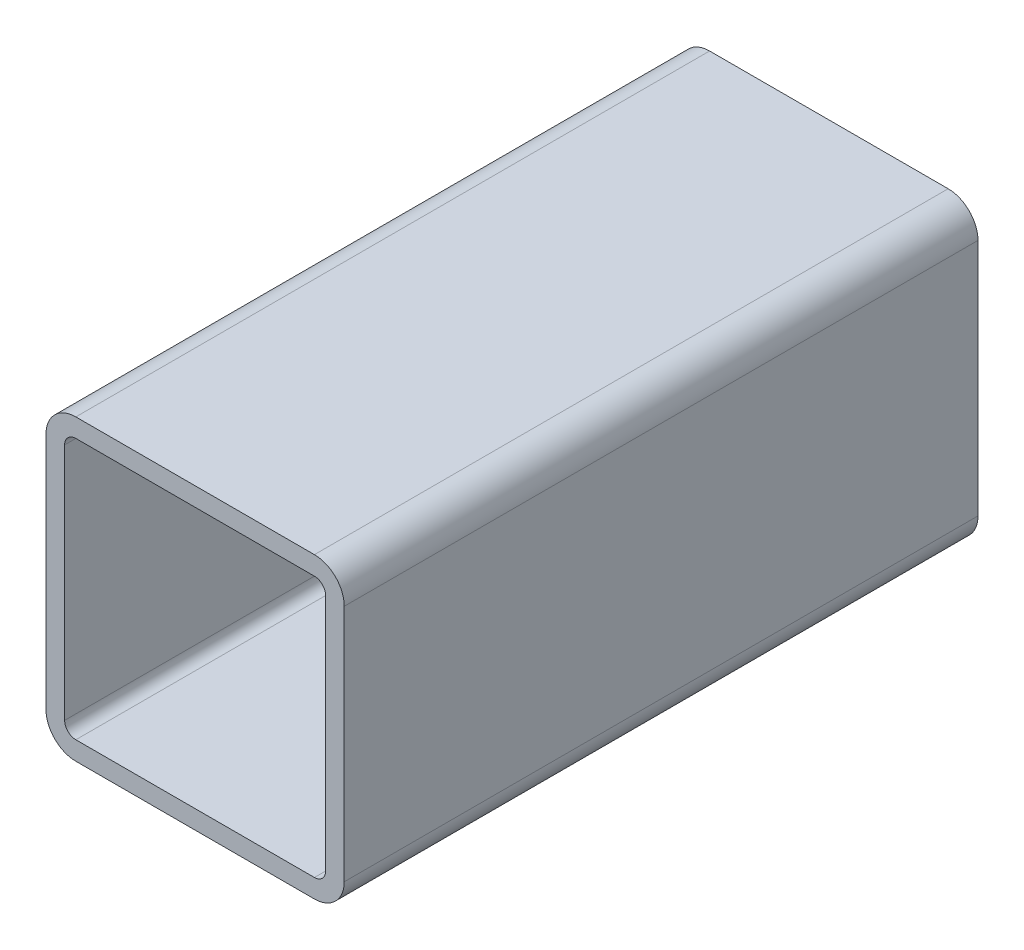
ISO-10303-21;
HEADER;
FILE_DESCRIPTION(('STEP AP214'),'2;1');
FILE_NAME('part.step','',(''),(''),'','','');
FILE_SCHEMA(('AUTOMOTIVE_DESIGN { 1 0 10303 214 1 1 1 1 }'));
ENDSEC;
DATA;
#1=APPLICATION_CONTEXT('core data for automotive mechanical design processes');
#2=APPLICATION_PROTOCOL_DEFINITION('international standard','automotive_design',2000,#1);
#3=PRODUCT_CONTEXT('',#1,'mechanical');
#4=PRODUCT('Part','Part','',(#3));
#5=PRODUCT_RELATED_PRODUCT_CATEGORY('part','',(#4));
#6=PRODUCT_DEFINITION_FORMATION('','',#4);
#7=PRODUCT_DEFINITION_CONTEXT('part definition',#1,'design');
#8=PRODUCT_DEFINITION('design','',#6,#7);
#9=PRODUCT_DEFINITION_SHAPE('','',#8);
#10=(LENGTH_UNIT() NAMED_UNIT(*) SI_UNIT(.MILLI.,.METRE.));
#11=(NAMED_UNIT(*) PLANE_ANGLE_UNIT() SI_UNIT($,.RADIAN.));
#12=(NAMED_UNIT(*) SI_UNIT($,.STERADIAN.) SOLID_ANGLE_UNIT());
#13=UNCERTAINTY_MEASURE_WITH_UNIT(LENGTH_MEASURE(1.E-05),#10,'distance_accuracy_value','');
#14=(GEOMETRIC_REPRESENTATION_CONTEXT(3) GLOBAL_UNCERTAINTY_ASSIGNED_CONTEXT((#13)) GLOBAL_UNIT_ASSIGNED_CONTEXT((#10,
#11,#12)) REPRESENTATION_CONTEXT('',''));
#15=CARTESIAN_POINT('',(0.,0.,0.));
#16=DIRECTION('',(0.,0.,1.));
#17=DIRECTION('',(1.,0.,0.));
#18=AXIS2_PLACEMENT_3D('',#15,#16,#17);
#19=CARTESIAN_POINT('',(-8.00000000000001,-5.62050406216485E-13,283.137084989848));
#20=DIRECTION('',(0.,1.,0.));
#21=DIRECTION('',(-1.,0.,0.));
#22=AXIS2_PLACEMENT_3D('',#19,#20,#21);
#23=PLANE('',#22);
#24=DIRECTION('',(1.,0.,0.));
#25=VECTOR('',#24,1.);
#26=CARTESIAN_POINT('',(-8.00000000000004,-5.62050406216485E-13,170.));
#27=LINE('',#26,#25);
#28=CARTESIAN_POINT('',(-72.,-5.72458747072346E-13,170.));
#29=VERTEX_POINT('',#28);
#30=CARTESIAN_POINT('',(-8.00000000000001,-5.62050406216485E-13,170.));
#31=VERTEX_POINT('',#30);
#32=EDGE_CURVE('E304',#29,#31,#27,.T.);
#33=ORIENTED_EDGE('',*,*,#32,.F.);
#34=DIRECTION('',(0.,0.,-1.));
#35=VECTOR('',#34,1.);
#36=CARTESIAN_POINT('',(-72.,-5.72458747072346E-13,283.137084989848));
#37=LINE('',#36,#35);
#38=CARTESIAN_POINT('',(-72.,-5.72458747072346E-13,0.));
#39=VERTEX_POINT('',#38);
#40=EDGE_CURVE('E48',#29,#39,#37,.T.);
#41=ORIENTED_EDGE('',*,*,#40,.T.);
#42=DIRECTION('',(1.,0.,0.));
#43=VECTOR('',#42,1.);
#44=CARTESIAN_POINT('',(-8.00000000000001,-5.62050406216485E-13,0.));
#45=LINE('',#44,#43);
#46=CARTESIAN_POINT('',(-8.00000000000001,-5.62050406216485E-13,0.));
#47=VERTEX_POINT('',#46);
#48=EDGE_CURVE('E199',#39,#47,#45,.T.);
#49=ORIENTED_EDGE('',*,*,#48,.T.);
#50=DIRECTION('',(0.,0.,-1.));
#51=VECTOR('',#50,1.);
#52=CARTESIAN_POINT('',(-8.00000000000001,-5.62050406216485E-13,283.137084989848));
#53=LINE('',#52,#51);
#54=EDGE_CURVE('E202',#31,#47,#53,.T.);
#55=ORIENTED_EDGE('',*,*,#54,.F.);
#56=EDGE_LOOP('',(#33,#41,#49,#55));
#57=FACE_BOUND('',#56,.T.);
#58=ADVANCED_FACE('F33',(#57),#23,.F.);
#59=CARTESIAN_POINT('',(-72.,7.99999999999943,283.137084989848));
#60=DIRECTION('',(0.,0.,-1.));
#61=DIRECTION('',(-1.,0.,0.));
#62=AXIS2_PLACEMENT_3D('',#59,#60,#61);
#63=CYLINDRICAL_SURFACE('',#62,8.00000000000001);
#64=CARTESIAN_POINT('',(-72.,7.99999999999943,170.));
#65=DIRECTION('',(0.,0.,1.));
#66=DIRECTION('',(0.,-1.,0.));
#67=AXIS2_PLACEMENT_3D('',#64,#65,#66);
#68=CIRCLE('',#67,8.00000000000001);
#69=CARTESIAN_POINT('',(-80.,7.99999999999943,170.));
#70=VERTEX_POINT('',#69);
#71=EDGE_CURVE('E240',#70,#29,#68,.T.);
#72=ORIENTED_EDGE('',*,*,#71,.F.);
#73=DIRECTION('',(0.,0.,-1.));
#74=VECTOR('',#73,1.);
#75=CARTESIAN_POINT('',(-80.,7.99999999999943,283.137084989848));
#76=LINE('',#75,#74);
#77=CARTESIAN_POINT('',(-80.,7.99999999999943,0.));
#78=VERTEX_POINT('',#77);
#79=EDGE_CURVE('E205',#70,#78,#76,.T.);
#80=ORIENTED_EDGE('',*,*,#79,.T.);
#81=CARTESIAN_POINT('',(-72.,7.99999999999943,0.));
#82=DIRECTION('',(0.,0.,1.));
#83=DIRECTION('',(1.,0.,0.));
#84=AXIS2_PLACEMENT_3D('',#81,#82,#83);
#85=CIRCLE('',#84,8.00000000000001);
#86=EDGE_CURVE('E197',#78,#39,#85,.T.);
#87=ORIENTED_EDGE('',*,*,#86,.T.);
#88=ORIENTED_EDGE('',*,*,#40,.F.);
#89=EDGE_LOOP('',(#72,#80,#87,#88));
#90=FACE_BOUND('',#89,.T.);
#91=ADVANCED_FACE('F237',(#90),#63,.T.);
#92=CARTESIAN_POINT('',(-80.,7.99999999999943,283.137084989848));
#93=DIRECTION('',(1.,0.,0.));
#94=DIRECTION('',(0.,1.,0.));
#95=AXIS2_PLACEMENT_3D('',#92,#93,#94);
#96=PLANE('',#95);
#97=DIRECTION('',(0.,-1.,0.));
#98=VECTOR('',#97,1.);
#99=CARTESIAN_POINT('',(-80.,7.99999999999946,170.));
#100=LINE('',#99,#98);
#101=CARTESIAN_POINT('',(-80.,71.9999999999994,170.));
#102=VERTEX_POINT('',#101);
#103=EDGE_CURVE('E245',#102,#70,#100,.T.);
#104=ORIENTED_EDGE('',*,*,#103,.F.);
#105=DIRECTION('',(0.,0.,-1.));
#106=VECTOR('',#105,1.);
#107=CARTESIAN_POINT('',(-80.,71.9999999999994,283.137084989848));
#108=LINE('',#107,#106);
#109=CARTESIAN_POINT('',(-80.,71.9999999999994,0.));
#110=VERTEX_POINT('',#109);
#111=EDGE_CURVE('E207',#102,#110,#108,.T.);
#112=ORIENTED_EDGE('',*,*,#111,.T.);
#113=DIRECTION('',(0.,-1.,0.));
#114=VECTOR('',#113,1.);
#115=CARTESIAN_POINT('',(-80.,7.99999999999943,0.));
#116=LINE('',#115,#114);
#117=EDGE_CURVE('E194',#110,#78,#116,.T.);
#118=ORIENTED_EDGE('',*,*,#117,.T.);
#119=ORIENTED_EDGE('',*,*,#79,.F.);
#120=EDGE_LOOP('',(#104,#112,#118,#119));
#121=FACE_BOUND('',#120,.T.);
#122=ADVANCED_FACE('F243',(#121),#96,.F.);
#123=CARTESIAN_POINT('',(-72.,71.9999999999994,283.137084989848));
#124=DIRECTION('',(0.,0.,-1.));
#125=DIRECTION('',(-1.,0.,0.));
#126=AXIS2_PLACEMENT_3D('',#123,#124,#125);
#127=CYLINDRICAL_SURFACE('',#126,7.99999999999999);
#128=CARTESIAN_POINT('',(-72.,71.9999999999994,170.));
#129=DIRECTION('',(0.,0.,1.));
#130=DIRECTION('',(0.,-1.,0.));
#131=AXIS2_PLACEMENT_3D('',#128,#129,#130);
#132=CIRCLE('',#131,7.99999999999999);
#133=CARTESIAN_POINT('',(-72.,79.9999999999994,170.));
#134=VERTEX_POINT('',#133);
#135=EDGE_CURVE('E308',#134,#102,#132,.T.);
#136=ORIENTED_EDGE('',*,*,#135,.F.);
#137=DIRECTION('',(0.,0.,-1.));
#138=VECTOR('',#137,1.);
#139=CARTESIAN_POINT('',(-72.,79.9999999999994,283.137084989848));
#140=LINE('',#139,#138);
#141=CARTESIAN_POINT('',(-72.,79.9999999999994,0.));
#142=VERTEX_POINT('',#141);
#143=EDGE_CURVE('E209',#134,#142,#140,.T.);
#144=ORIENTED_EDGE('',*,*,#143,.T.);
#145=CARTESIAN_POINT('',(-72.,71.9999999999994,0.));
#146=DIRECTION('',(0.,0.,1.));
#147=DIRECTION('',(1.,0.,0.));
#148=AXIS2_PLACEMENT_3D('',#145,#146,#147);
#149=CIRCLE('',#148,7.99999999999999);
#150=EDGE_CURVE('E191',#142,#110,#149,.T.);
#151=ORIENTED_EDGE('',*,*,#150,.T.);
#152=ORIENTED_EDGE('',*,*,#111,.F.);
#153=EDGE_LOOP('',(#136,#144,#151,#152));
#154=FACE_BOUND('',#153,.T.);
#155=ADVANCED_FACE('F248',(#154),#127,.T.);
#156=CARTESIAN_POINT('',(-8.00000000000001,79.9999999999994,283.137084989848));
#157=DIRECTION('',(0.,-1.,0.));
#158=DIRECTION('',(1.,0.,0.));
#159=AXIS2_PLACEMENT_3D('',#156,#157,#158);
#160=PLANE('',#159);
#161=DIRECTION('',(-1.,0.,0.));
#162=VECTOR('',#161,1.);
#163=CARTESIAN_POINT('',(-8.00000000000004,79.9999999999994,170.));
#164=LINE('',#163,#162);
#165=CARTESIAN_POINT('',(-8.00000000000001,79.9999999999994,170.));
#166=VERTEX_POINT('',#165);
#167=EDGE_CURVE('E254',#166,#134,#164,.T.);
#168=ORIENTED_EDGE('',*,*,#167,.F.);
#169=DIRECTION('',(0.,0.,-1.));
#170=VECTOR('',#169,1.);
#171=CARTESIAN_POINT('',(-8.00000000000001,79.9999999999994,283.137084989848));
#172=LINE('',#171,#170);
#173=CARTESIAN_POINT('',(-8.00000000000001,79.9999999999994,0.));
#174=VERTEX_POINT('',#173);
#175=EDGE_CURVE('E211',#166,#174,#172,.T.);
#176=ORIENTED_EDGE('',*,*,#175,.T.);
#177=DIRECTION('',(-1.,0.,0.));
#178=VECTOR('',#177,1.);
#179=CARTESIAN_POINT('',(-8.00000000000001,79.9999999999994,0.));
#180=LINE('',#179,#178);
#181=EDGE_CURVE('E188',#174,#142,#180,.T.);
#182=ORIENTED_EDGE('',*,*,#181,.T.);
#183=ORIENTED_EDGE('',*,*,#143,.F.);
#184=EDGE_LOOP('',(#168,#176,#182,#183));
#185=FACE_BOUND('',#184,.T.);
#186=ADVANCED_FACE('F251',(#185),#160,.F.);
#187=CARTESIAN_POINT('',(-8.00000000000001,71.9999999999994,283.137084989848));
#188=DIRECTION('',(0.,0.,-1.));
#189=DIRECTION('',(-1.,0.,0.));
#190=AXIS2_PLACEMENT_3D('',#187,#188,#189);
#191=CYLINDRICAL_SURFACE('',#190,8.);
#192=CARTESIAN_POINT('',(-8.00000000000001,71.9999999999994,170.));
#193=DIRECTION('',(0.,0.,1.));
#194=DIRECTION('',(0.,-1.,0.));
#195=AXIS2_PLACEMENT_3D('',#192,#193,#194);
#196=CIRCLE('',#195,8.);
#197=CARTESIAN_POINT('',(0.,71.9999999999994,170.));
#198=VERTEX_POINT('',#197);
#199=EDGE_CURVE('E258',#198,#166,#196,.T.);
#200=ORIENTED_EDGE('',*,*,#199,.F.);
#201=DIRECTION('',(0.,0.,-1.));
#202=VECTOR('',#201,1.);
#203=CARTESIAN_POINT('',(0.,71.9999999999994,283.137084989848));
#204=LINE('',#203,#202);
#205=CARTESIAN_POINT('',(0.,71.9999999999994,0.));
#206=VERTEX_POINT('',#205);
#207=EDGE_CURVE('E213',#198,#206,#204,.T.);
#208=ORIENTED_EDGE('',*,*,#207,.T.);
#209=CARTESIAN_POINT('',(-8.00000000000001,71.9999999999994,0.));
#210=DIRECTION('',(0.,0.,1.));
#211=DIRECTION('',(1.,0.,0.));
#212=AXIS2_PLACEMENT_3D('',#209,#210,#211);
#213=CIRCLE('',#212,8.);
#214=EDGE_CURVE('E185',#206,#174,#213,.T.);
#215=ORIENTED_EDGE('',*,*,#214,.T.);
#216=ORIENTED_EDGE('',*,*,#175,.F.);
#217=EDGE_LOOP('',(#200,#208,#215,#216));
#218=FACE_BOUND('',#217,.T.);
#219=ADVANCED_FACE('F257',(#218),#191,.T.);
#220=CARTESIAN_POINT('',(0.,7.99999999999944,283.137084989848));
#221=DIRECTION('',(-1.,0.,0.));
#222=DIRECTION('',(0.,0.,1.));
#223=AXIS2_PLACEMENT_3D('',#220,#221,#222);
#224=PLANE('',#223);
#225=DIRECTION('',(0.,1.,0.));
#226=VECTOR('',#225,1.);
#227=CARTESIAN_POINT('',(0.,7.99999999999947,170.));
#228=LINE('',#227,#226);
#229=CARTESIAN_POINT('',(0.,7.99999999999944,170.));
#230=VERTEX_POINT('',#229);
#231=EDGE_CURVE('E221',#230,#198,#228,.T.);
#232=ORIENTED_EDGE('',*,*,#231,.F.);
#233=DIRECTION('',(0.,0.,-1.));
#234=VECTOR('',#233,1.);
#235=CARTESIAN_POINT('',(0.,7.99999999999944,283.137084989848));
#236=LINE('',#235,#234);
#237=CARTESIAN_POINT('',(0.,7.99999999999944,0.));
#238=VERTEX_POINT('',#237);
#239=EDGE_CURVE('E41',#230,#238,#236,.T.);
#240=ORIENTED_EDGE('',*,*,#239,.T.);
#241=DIRECTION('',(0.,1.,0.));
#242=VECTOR('',#241,1.);
#243=CARTESIAN_POINT('',(0.,7.99999999999944,0.));
#244=LINE('',#243,#242);
#245=EDGE_CURVE('E182',#238,#206,#244,.T.);
#246=ORIENTED_EDGE('',*,*,#245,.T.);
#247=ORIENTED_EDGE('',*,*,#207,.F.);
#248=EDGE_LOOP('',(#232,#240,#246,#247));
#249=FACE_BOUND('',#248,.T.);
#250=ADVANCED_FACE('F217',(#249),#224,.F.);
#251=CARTESIAN_POINT('',(-8.00000000000001,7.99999999999944,283.137084989848));
#252=DIRECTION('',(0.,0.,-1.));
#253=DIRECTION('',(-1.,0.,0.));
#254=AXIS2_PLACEMENT_3D('',#251,#252,#253);
#255=CYLINDRICAL_SURFACE('',#254,8.);
#256=CARTESIAN_POINT('',(-8.00000000000001,7.99999999999944,170.));
#257=DIRECTION('',(0.,0.,1.));
#258=DIRECTION('',(0.,-1.,0.));
#259=AXIS2_PLACEMENT_3D('',#256,#257,#258);
#260=CIRCLE('',#259,8.);
#261=EDGE_CURVE('E231',#31,#230,#260,.T.);
#262=ORIENTED_EDGE('',*,*,#261,.F.);
#263=ORIENTED_EDGE('',*,*,#54,.T.);
#264=CARTESIAN_POINT('',(-8.00000000000001,7.99999999999944,0.));
#265=DIRECTION('',(0.,0.,1.));
#266=DIRECTION('',(1.,0.,0.));
#267=AXIS2_PLACEMENT_3D('',#264,#265,#266);
#268=CIRCLE('',#267,8.);
#269=EDGE_CURVE('E179',#47,#238,#268,.T.);
#270=ORIENTED_EDGE('',*,*,#269,.T.);
#271=ORIENTED_EDGE('',*,*,#239,.F.);
#272=EDGE_LOOP('',(#262,#263,#270,#271));
#273=FACE_BOUND('',#272,.T.);
#274=ADVANCED_FACE('F35',(#273),#255,.T.);
#275=CARTESIAN_POINT('',(-8.00000000000001,7.99999999999944,0.));
#276=DIRECTION('',(0.,0.,1.));
#277=DIRECTION('',(1.,0.,0.));
#278=AXIS2_PLACEMENT_3D('',#275,#276,#277);
#279=PLANE('',#278);
#280=ORIENTED_EDGE('',*,*,#269,.F.);
#281=ORIENTED_EDGE('',*,*,#48,.F.);
#282=ORIENTED_EDGE('',*,*,#86,.F.);
#283=ORIENTED_EDGE('',*,*,#117,.F.);
#284=ORIENTED_EDGE('',*,*,#150,.F.);
#285=ORIENTED_EDGE('',*,*,#181,.F.);
#286=ORIENTED_EDGE('',*,*,#214,.F.);
#287=ORIENTED_EDGE('',*,*,#245,.F.);
#288=EDGE_LOOP('',(#280,#281,#282,#283,#284,#285,#286,#287));
#289=FACE_BOUND('',#288,.T.);
#290=CARTESIAN_POINT('',(-8.00000000000001,7.99999999999944,0.));
#291=DIRECTION('',(0.,0.,1.));
#292=DIRECTION('',(1.,0.,0.));
#293=AXIS2_PLACEMENT_3D('',#290,#291,#292);
#294=CIRCLE('',#293,3.);
#295=CARTESIAN_POINT('',(-8.00000000000001,4.99999999999944,0.));
#296=VERTEX_POINT('',#295);
#297=CARTESIAN_POINT('',(-5.00000000000001,7.99999999999944,0.));
#298=VERTEX_POINT('',#297);
#299=EDGE_CURVE('E260',#296,#298,#294,.T.);
#300=ORIENTED_EDGE('',*,*,#299,.T.);
#301=DIRECTION('',(0.,1.,0.));
#302=VECTOR('',#301,1.);
#303=CARTESIAN_POINT('',(-5.00000000000001,7.99999999999944,0.));
#304=LINE('',#303,#302);
#305=CARTESIAN_POINT('',(-5.00000000000001,71.9999999999994,0.));
#306=VERTEX_POINT('',#305);
#307=EDGE_CURVE('E267',#298,#306,#304,.T.);
#308=ORIENTED_EDGE('',*,*,#307,.T.);
#309=CARTESIAN_POINT('',(-8.00000000000001,71.9999999999994,0.));
#310=DIRECTION('',(0.,0.,1.));
#311=DIRECTION('',(1.,0.,0.));
#312=AXIS2_PLACEMENT_3D('',#309,#310,#311);
#313=CIRCLE('',#312,3.);
#314=CARTESIAN_POINT('',(-8.00000000000001,74.9999999999994,0.));
#315=VERTEX_POINT('',#314);
#316=EDGE_CURVE('E270',#306,#315,#313,.T.);
#317=ORIENTED_EDGE('',*,*,#316,.T.);
#318=DIRECTION('',(-1.,0.,0.));
#319=VECTOR('',#318,1.);
#320=CARTESIAN_POINT('',(-8.00000000000001,74.9999999999994,0.));
#321=LINE('',#320,#319);
#322=CARTESIAN_POINT('',(-72.,74.9999999999994,0.));
#323=VERTEX_POINT('',#322);
#324=EDGE_CURVE('E273',#315,#323,#321,.T.);
#325=ORIENTED_EDGE('',*,*,#324,.T.);
#326=CARTESIAN_POINT('',(-72.,71.9999999999994,0.));
#327=DIRECTION('',(0.,0.,1.));
#328=DIRECTION('',(1.,0.,0.));
#329=AXIS2_PLACEMENT_3D('',#326,#327,#328);
#330=CIRCLE('',#329,3.);
#331=CARTESIAN_POINT('',(-75.,71.9999999999994,0.));
#332=VERTEX_POINT('',#331);
#333=EDGE_CURVE('E276',#323,#332,#330,.T.);
#334=ORIENTED_EDGE('',*,*,#333,.T.);
#335=DIRECTION('',(0.,-1.,0.));
#336=VECTOR('',#335,1.);
#337=CARTESIAN_POINT('',(-75.,7.99999999999943,0.));
#338=LINE('',#337,#336);
#339=CARTESIAN_POINT('',(-75.,7.99999999999943,0.));
#340=VERTEX_POINT('',#339);
#341=EDGE_CURVE('E279',#332,#340,#338,.T.);
#342=ORIENTED_EDGE('',*,*,#341,.T.);
#343=CARTESIAN_POINT('',(-72.,7.99999999999943,0.));
#344=DIRECTION('',(0.,0.,1.));
#345=DIRECTION('',(1.,0.,0.));
#346=AXIS2_PLACEMENT_3D('',#343,#344,#345);
#347=CIRCLE('',#346,3.);
#348=CARTESIAN_POINT('',(-72.,4.99999999999943,0.));
#349=VERTEX_POINT('',#348);
#350=EDGE_CURVE('E282',#340,#349,#347,.T.);
#351=ORIENTED_EDGE('',*,*,#350,.T.);
#352=DIRECTION('',(1.,0.,0.));
#353=VECTOR('',#352,1.);
#354=CARTESIAN_POINT('',(-8.00000000000001,4.99999999999944,0.));
#355=LINE('',#354,#353);
#356=EDGE_CURVE('E161',#349,#296,#355,.T.);
#357=ORIENTED_EDGE('',*,*,#356,.T.);
#358=EDGE_LOOP('',(#300,#308,#317,#325,#334,#342,#351,#357));
#359=FACE_BOUND('',#358,.T.);
#360=ADVANCED_FACE('F227',(#289,#359),#279,.F.);
#361=CARTESIAN_POINT('',(-8.00000000000001,4.99999999999944,283.137084989848));
#362=DIRECTION('',(0.,1.,0.));
#363=DIRECTION('',(-1.,0.,0.));
#364=AXIS2_PLACEMENT_3D('',#361,#362,#363);
#365=PLANE('',#364);
#366=DIRECTION('',(0.,0.,-1.));
#367=VECTOR('',#366,1.);
#368=CARTESIAN_POINT('',(-72.,4.99999999999943,283.137084989848));
#369=LINE('',#368,#367);
#370=CARTESIAN_POINT('',(-72.,4.99999999999943,170.));
#371=VERTEX_POINT('',#370);
#372=EDGE_CURVE('E153',#371,#349,#369,.T.);
#373=ORIENTED_EDGE('',*,*,#372,.F.);
#374=DIRECTION('',(1.,0.,0.));
#375=VECTOR('',#374,1.);
#376=CARTESIAN_POINT('',(-8.00000000000004,4.99999999999944,170.));
#377=LINE('',#376,#375);
#378=CARTESIAN_POINT('',(-8.00000000000001,4.99999999999944,170.));
#379=VERTEX_POINT('',#378);
#380=EDGE_CURVE('E11',#371,#379,#377,.T.);
#381=ORIENTED_EDGE('',*,*,#380,.T.);
#382=DIRECTION('',(0.,0.,-1.));
#383=VECTOR('',#382,1.);
#384=CARTESIAN_POINT('',(-8.00000000000001,4.99999999999944,283.137084989848));
#385=LINE('',#384,#383);
#386=EDGE_CURVE('E163',#379,#296,#385,.T.);
#387=ORIENTED_EDGE('',*,*,#386,.T.);
#388=ORIENTED_EDGE('',*,*,#356,.F.);
#389=EDGE_LOOP('',(#373,#381,#387,#388));
#390=FACE_BOUND('',#389,.T.);
#391=ADVANCED_FACE('F159',(#390),#365,.T.);
#392=CARTESIAN_POINT('',(-72.,7.99999999999943,283.137084989848));
#393=DIRECTION('',(0.,0.,-1.));
#394=DIRECTION('',(-1.,0.,0.));
#395=AXIS2_PLACEMENT_3D('',#392,#393,#394);
#396=CYLINDRICAL_SURFACE('',#395,3.);
#397=DIRECTION('',(0.,0.,-1.));
#398=VECTOR('',#397,1.);
#399=CARTESIAN_POINT('',(-75.,7.99999999999943,283.137084989848));
#400=LINE('',#399,#398);
#401=CARTESIAN_POINT('',(-75.,7.99999999999943,170.));
#402=VERTEX_POINT('',#401);
#403=EDGE_CURVE('E155',#402,#340,#400,.T.);
#404=ORIENTED_EDGE('',*,*,#403,.F.);
#405=CARTESIAN_POINT('',(-72.,7.99999999999943,170.));
#406=DIRECTION('',(0.,0.,1.));
#407=DIRECTION('',(0.,-1.,0.));
#408=AXIS2_PLACEMENT_3D('',#405,#406,#407);
#409=CIRCLE('',#408,3.);
#410=EDGE_CURVE('E146',#402,#371,#409,.T.);
#411=ORIENTED_EDGE('',*,*,#410,.T.);
#412=ORIENTED_EDGE('',*,*,#372,.T.);
#413=ORIENTED_EDGE('',*,*,#350,.F.);
#414=EDGE_LOOP('',(#404,#411,#412,#413));
#415=FACE_BOUND('',#414,.T.);
#416=ADVANCED_FACE('F151',(#415),#396,.F.);
#417=CARTESIAN_POINT('',(-75.,7.99999999999943,283.137084989848));
#418=DIRECTION('',(1.,0.,0.));
#419=DIRECTION('',(0.,0.,-1.));
#420=AXIS2_PLACEMENT_3D('',#417,#418,#419);
#421=PLANE('',#420);
#422=DIRECTION('',(0.,0.,-1.));
#423=VECTOR('',#422,1.);
#424=CARTESIAN_POINT('',(-75.,71.9999999999994,283.137084989848));
#425=LINE('',#424,#423);
#426=CARTESIAN_POINT('',(-75.,71.9999999999994,170.));
#427=VERTEX_POINT('',#426);
#428=EDGE_CURVE('E165',#427,#332,#425,.T.);
#429=ORIENTED_EDGE('',*,*,#428,.F.);
#430=DIRECTION('',(0.,-1.,0.));
#431=VECTOR('',#430,1.);
#432=CARTESIAN_POINT('',(-75.,7.99999999999946,170.));
#433=LINE('',#432,#431);
#434=EDGE_CURVE('E157',#427,#402,#433,.T.);
#435=ORIENTED_EDGE('',*,*,#434,.T.);
#436=ORIENTED_EDGE('',*,*,#403,.T.);
#437=ORIENTED_EDGE('',*,*,#341,.F.);
#438=EDGE_LOOP('',(#429,#435,#436,#437));
#439=FACE_BOUND('',#438,.T.);
#440=ADVANCED_FACE('F288',(#439),#421,.T.);
#441=CARTESIAN_POINT('',(-72.,71.9999999999994,283.137084989848));
#442=DIRECTION('',(0.,0.,-1.));
#443=DIRECTION('',(-1.,0.,0.));
#444=AXIS2_PLACEMENT_3D('',#441,#442,#443);
#445=CYLINDRICAL_SURFACE('',#444,3.);
#446=DIRECTION('',(0.,0.,-1.));
#447=VECTOR('',#446,1.);
#448=CARTESIAN_POINT('',(-72.,74.9999999999994,283.137084989848));
#449=LINE('',#448,#447);
#450=CARTESIAN_POINT('',(-72.,74.9999999999994,170.));
#451=VERTEX_POINT('',#450);
#452=EDGE_CURVE('E171',#451,#323,#449,.T.);
#453=ORIENTED_EDGE('',*,*,#452,.F.);
#454=CARTESIAN_POINT('',(-72.,71.9999999999994,170.));
#455=DIRECTION('',(0.,0.,1.));
#456=DIRECTION('',(0.,-1.,0.));
#457=AXIS2_PLACEMENT_3D('',#454,#455,#456);
#458=CIRCLE('',#457,3.);
#459=EDGE_CURVE('E290',#451,#427,#458,.T.);
#460=ORIENTED_EDGE('',*,*,#459,.T.);
#461=ORIENTED_EDGE('',*,*,#428,.T.);
#462=ORIENTED_EDGE('',*,*,#333,.F.);
#463=EDGE_LOOP('',(#453,#460,#461,#462));
#464=FACE_BOUND('',#463,.T.);
#465=ADVANCED_FACE('F325',(#464),#445,.F.);
#466=CARTESIAN_POINT('',(-8.00000000000001,74.9999999999994,283.137084989848));
#467=DIRECTION('',(0.,-1.,0.));
#468=DIRECTION('',(1.,0.,0.));
#469=AXIS2_PLACEMENT_3D('',#466,#467,#468);
#470=PLANE('',#469);
#471=DIRECTION('',(0.,0.,-1.));
#472=VECTOR('',#471,1.);
#473=CARTESIAN_POINT('',(-8.00000000000001,74.9999999999994,283.137084989848));
#474=LINE('',#473,#472);
#475=CARTESIAN_POINT('',(-8.00000000000001,74.9999999999994,170.));
#476=VERTEX_POINT('',#475);
#477=EDGE_CURVE('E173',#476,#315,#474,.T.);
#478=ORIENTED_EDGE('',*,*,#477,.F.);
#479=DIRECTION('',(-1.,0.,0.));
#480=VECTOR('',#479,1.);
#481=CARTESIAN_POINT('',(-8.00000000000004,74.9999999999994,170.));
#482=LINE('',#481,#480);
#483=EDGE_CURVE('E292',#476,#451,#482,.T.);
#484=ORIENTED_EDGE('',*,*,#483,.T.);
#485=ORIENTED_EDGE('',*,*,#452,.T.);
#486=ORIENTED_EDGE('',*,*,#324,.F.);
#487=EDGE_LOOP('',(#478,#484,#485,#486));
#488=FACE_BOUND('',#487,.T.);
#489=ADVANCED_FACE('F322',(#488),#470,.T.);
#490=CARTESIAN_POINT('',(-8.00000000000001,71.9999999999994,283.137084989848));
#491=DIRECTION('',(0.,0.,-1.));
#492=DIRECTION('',(-1.,0.,0.));
#493=AXIS2_PLACEMENT_3D('',#490,#491,#492);
#494=CYLINDRICAL_SURFACE('',#493,3.);
#495=DIRECTION('',(0.,0.,-1.));
#496=VECTOR('',#495,1.);
#497=CARTESIAN_POINT('',(-5.00000000000001,71.9999999999994,283.137084989848));
#498=LINE('',#497,#496);
#499=CARTESIAN_POINT('',(-5.00000000000001,71.9999999999994,170.));
#500=VERTEX_POINT('',#499);
#501=EDGE_CURVE('E175',#500,#306,#498,.T.);
#502=ORIENTED_EDGE('',*,*,#501,.F.);
#503=CARTESIAN_POINT('',(-8.00000000000001,71.9999999999994,170.));
#504=DIRECTION('',(0.,0.,1.));
#505=DIRECTION('',(0.,-1.,0.));
#506=AXIS2_PLACEMENT_3D('',#503,#504,#505);
#507=CIRCLE('',#506,3.);
#508=EDGE_CURVE('E297',#500,#476,#507,.T.);
#509=ORIENTED_EDGE('',*,*,#508,.T.);
#510=ORIENTED_EDGE('',*,*,#477,.T.);
#511=ORIENTED_EDGE('',*,*,#316,.F.);
#512=EDGE_LOOP('',(#502,#509,#510,#511));
#513=FACE_BOUND('',#512,.T.);
#514=ADVANCED_FACE('F319',(#513),#494,.F.);
#515=CARTESIAN_POINT('',(-5.00000000000001,7.99999999999944,283.137084989848));
#516=DIRECTION('',(-1.,0.,0.));
#517=DIRECTION('',(0.,0.,1.));
#518=AXIS2_PLACEMENT_3D('',#515,#516,#517);
#519=PLANE('',#518);
#520=DIRECTION('',(0.,0.,-1.));
#521=VECTOR('',#520,1.);
#522=CARTESIAN_POINT('',(-5.00000000000001,7.99999999999944,283.137084989848));
#523=LINE('',#522,#521);
#524=CARTESIAN_POINT('',(-5.00000000000001,7.99999999999944,170.));
#525=VERTEX_POINT('',#524);
#526=EDGE_CURVE('E177',#525,#298,#523,.T.);
#527=ORIENTED_EDGE('',*,*,#526,.F.);
#528=DIRECTION('',(0.,1.,0.));
#529=VECTOR('',#528,1.);
#530=CARTESIAN_POINT('',(-5.00000000000001,7.99999999999947,170.));
#531=LINE('',#530,#529);
#532=EDGE_CURVE('E300',#525,#500,#531,.T.);
#533=ORIENTED_EDGE('',*,*,#532,.T.);
#534=ORIENTED_EDGE('',*,*,#501,.T.);
#535=ORIENTED_EDGE('',*,*,#307,.F.);
#536=EDGE_LOOP('',(#527,#533,#534,#535));
#537=FACE_BOUND('',#536,.T.);
#538=ADVANCED_FACE('F314',(#537),#519,.T.);
#539=CARTESIAN_POINT('',(-8.00000000000001,7.99999999999944,283.137084989848));
#540=DIRECTION('',(0.,0.,-1.));
#541=DIRECTION('',(-1.,0.,0.));
#542=AXIS2_PLACEMENT_3D('',#539,#540,#541);
#543=CYLINDRICAL_SURFACE('',#542,3.);
#544=ORIENTED_EDGE('',*,*,#386,.F.);
#545=CARTESIAN_POINT('',(-8.00000000000001,7.99999999999944,170.));
#546=DIRECTION('',(0.,0.,1.));
#547=DIRECTION('',(0.,-1.,0.));
#548=AXIS2_PLACEMENT_3D('',#545,#546,#547);
#549=CIRCLE('',#548,3.);
#550=EDGE_CURVE('E56',#379,#525,#549,.T.);
#551=ORIENTED_EDGE('',*,*,#550,.T.);
#552=ORIENTED_EDGE('',*,*,#526,.T.);
#553=ORIENTED_EDGE('',*,*,#299,.F.);
#554=EDGE_LOOP('',(#544,#551,#552,#553));
#555=FACE_BOUND('',#554,.T.);
#556=ADVANCED_FACE('F310',(#555),#543,.F.);
#557=CARTESIAN_POINT('',(113.137084989848,7.99999999999983,170.));
#558=DIRECTION('',(0.,0.,1.));
#559=DIRECTION('',(1.,0.,0.));
#560=AXIS2_PLACEMENT_3D('',#557,#558,#559);
#561=PLANE('',#560);
#562=ORIENTED_EDGE('',*,*,#550,.F.);
#563=ORIENTED_EDGE('',*,*,#380,.F.);
#564=ORIENTED_EDGE('',*,*,#410,.F.);
#565=ORIENTED_EDGE('',*,*,#434,.F.);
#566=ORIENTED_EDGE('',*,*,#459,.F.);
#567=ORIENTED_EDGE('',*,*,#483,.F.);
#568=ORIENTED_EDGE('',*,*,#508,.F.);
#569=ORIENTED_EDGE('',*,*,#532,.F.);
#570=EDGE_LOOP('',(#562,#563,#564,#565,#566,#567,#568,#569));
#571=FACE_BOUND('',#570,.T.);
#572=ORIENTED_EDGE('',*,*,#32,.T.);
#573=ORIENTED_EDGE('',*,*,#261,.T.);
#574=ORIENTED_EDGE('',*,*,#231,.T.);
#575=ORIENTED_EDGE('',*,*,#199,.T.);
#576=ORIENTED_EDGE('',*,*,#167,.T.);
#577=ORIENTED_EDGE('',*,*,#135,.T.);
#578=ORIENTED_EDGE('',*,*,#103,.T.);
#579=ORIENTED_EDGE('',*,*,#71,.T.);
#580=EDGE_LOOP('',(#572,#573,#574,#575,#576,#577,#578,#579));
#581=FACE_BOUND('',#580,.T.);
#582=ADVANCED_FACE('F144',(#571,#581),#561,.T.);
#583=CLOSED_SHELL('',(#58,#91,#122,#155,#186,#219,#250,#274,#360,#391,#416,#440,#465,#489,#514,
#538,#556,#582));
#584=MANIFOLD_SOLID_BREP('B2',#583);
#585=ADVANCED_BREP_SHAPE_REPRESENTATION('',(#18,#584),#14);
#586=SHAPE_DEFINITION_REPRESENTATION(#9,#585);
ENDSEC;
END-ISO-10303-21;
